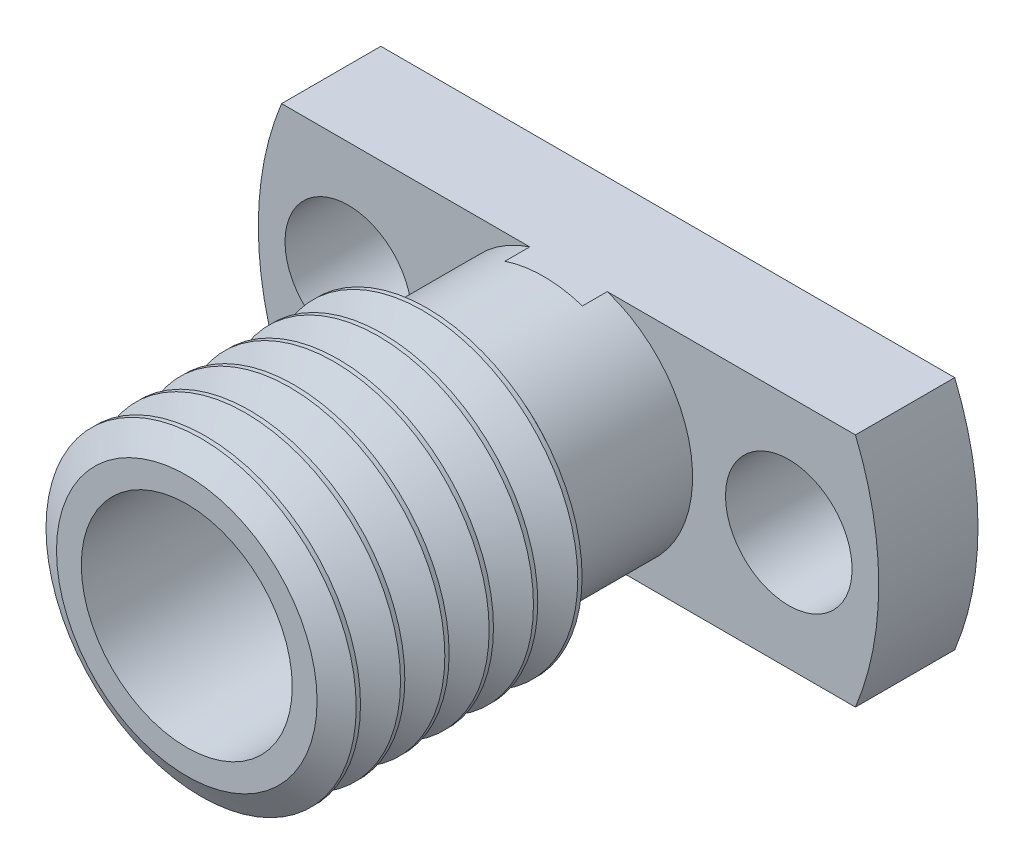
ISO-10303-21;
HEADER;
FILE_DESCRIPTION(('STEP AP214'),'2;1');
FILE_NAME('part.step','',(''),(''),'','','');
FILE_SCHEMA(('AUTOMOTIVE_DESIGN { 1 0 10303 214 1 1 1 1 }'));
ENDSEC;
DATA;
#1=APPLICATION_CONTEXT('core data for automotive mechanical design processes');
#2=APPLICATION_PROTOCOL_DEFINITION('international standard','automotive_design',2000,#1);
#3=PRODUCT_CONTEXT('',#1,'mechanical');
#4=PRODUCT('Part','Part','',(#3));
#5=PRODUCT_RELATED_PRODUCT_CATEGORY('part','',(#4));
#6=PRODUCT_DEFINITION_FORMATION('','',#4);
#7=PRODUCT_DEFINITION_CONTEXT('part definition',#1,'design');
#8=PRODUCT_DEFINITION('design','',#6,#7);
#9=PRODUCT_DEFINITION_SHAPE('','',#8);
#10=(LENGTH_UNIT() NAMED_UNIT(*) SI_UNIT(.MILLI.,.METRE.));
#11=(NAMED_UNIT(*) PLANE_ANGLE_UNIT() SI_UNIT($,.RADIAN.));
#12=(NAMED_UNIT(*) SI_UNIT($,.STERADIAN.) SOLID_ANGLE_UNIT());
#13=UNCERTAINTY_MEASURE_WITH_UNIT(LENGTH_MEASURE(1.E-05),#10,'distance_accuracy_value','');
#14=(GEOMETRIC_REPRESENTATION_CONTEXT(3) GLOBAL_UNCERTAINTY_ASSIGNED_CONTEXT((#13)) GLOBAL_UNIT_ASSIGNED_CONTEXT((#10,
#11,#12)) REPRESENTATION_CONTEXT('',''));
#15=CARTESIAN_POINT('',(0.,0.,0.));
#16=DIRECTION('',(0.,0.,1.));
#17=DIRECTION('',(1.,0.,0.));
#18=AXIS2_PLACEMENT_3D('',#15,#16,#17);
#19=CARTESIAN_POINT('',(0.,0.,6.79387936779219));
#20=DIRECTION('',(0.,0.,1.));
#21=DIRECTION('',(1.,0.,0.));
#22=AXIS2_PLACEMENT_3D('',#19,#20,#21);
#23=CYLINDRICAL_SURFACE('',#22,3.175);
#24=CARTESIAN_POINT('',(0.,0.,5.83651259567367));
#25=DIRECTION('',(0.,0.,1.));
#26=DIRECTION('',(1.,0.,0.));
#27=AXIS2_PLACEMENT_3D('',#24,#25,#26);
#28=CIRCLE('',#27,3.175);
#29=CARTESIAN_POINT('',(3.175,0.,5.83651259567367));
#30=VERTEX_POINT('',#29);
#31=EDGE_CURVE('E232',#30,#30,#28,.T.);
#32=ORIENTED_EDGE('',*,*,#31,.T.);
#33=EDGE_LOOP('',(#32));
#34=FACE_BOUND('',#33,.T.);
#35=CARTESIAN_POINT('',(0.,0.,5.92450077669817));
#36=DIRECTION('',(0.,0.,-1.));
#37=DIRECTION('',(-1.,0.,0.));
#38=AXIS2_PLACEMENT_3D('',#35,#36,#37);
#39=CIRCLE('',#38,3.175);
#40=CARTESIAN_POINT('',(-3.175,0.,5.92450077669817));
#41=VERTEX_POINT('',#40);
#42=EDGE_CURVE('E222',#41,#41,#39,.T.);
#43=ORIENTED_EDGE('',*,*,#42,.T.);
#44=EDGE_LOOP('',(#43));
#45=FACE_BOUND('',#44,.T.);
#46=ADVANCED_FACE('F37',(#34,#45),#23,.T.);
#47=CARTESIAN_POINT('',(0.,0.,6.74365545281653));
#48=DIRECTION('',(0.,0.,1.));
#49=DIRECTION('',(1.,0.,0.));
#50=AXIS2_PLACEMENT_3D('',#47,#48,#49);
#51=CIRCLE('',#50,3.175);
#52=CARTESIAN_POINT('',(3.175,0.,6.74365545281653));
#53=VERTEX_POINT('',#52);
#54=EDGE_CURVE('E225',#53,#53,#51,.T.);
#55=ORIENTED_EDGE('',*,*,#54,.T.);
#56=EDGE_LOOP('',(#55));
#57=FACE_BOUND('',#56,.T.);
#58=CARTESIAN_POINT('',(0.,0.,6.83164363384103));
#59=DIRECTION('',(0.,0.,-1.));
#60=DIRECTION('',(-1.,0.,0.));
#61=AXIS2_PLACEMENT_3D('',#58,#59,#60);
#62=CIRCLE('',#61,3.175);
#63=CARTESIAN_POINT('',(-3.175,0.,6.83164363384103));
#64=VERTEX_POINT('',#63);
#65=EDGE_CURVE('E215',#64,#64,#62,.T.);
#66=ORIENTED_EDGE('',*,*,#65,.T.);
#67=EDGE_LOOP('',(#66));
#68=FACE_BOUND('',#67,.T.);
#69=ADVANCED_FACE('F293',(#57,#68),#23,.T.);
#70=CARTESIAN_POINT('',(0.,0.,7.65079830995939));
#71=DIRECTION('',(0.,0.,1.));
#72=DIRECTION('',(1.,0.,0.));
#73=AXIS2_PLACEMENT_3D('',#70,#71,#72);
#74=CIRCLE('',#73,3.175);
#75=CARTESIAN_POINT('',(3.175,0.,7.65079830995939));
#76=VERTEX_POINT('',#75);
#77=EDGE_CURVE('E218',#76,#76,#74,.T.);
#78=ORIENTED_EDGE('',*,*,#77,.T.);
#79=EDGE_LOOP('',(#78));
#80=FACE_BOUND('',#79,.T.);
#81=CARTESIAN_POINT('',(0.,0.,7.73878649098389));
#82=DIRECTION('',(0.,0.,-1.));
#83=DIRECTION('',(-1.,0.,0.));
#84=AXIS2_PLACEMENT_3D('',#81,#82,#83);
#85=CIRCLE('',#84,3.175);
#86=CARTESIAN_POINT('',(-3.175,0.,7.73878649098389));
#87=VERTEX_POINT('',#86);
#88=EDGE_CURVE('E208',#87,#87,#85,.T.);
#89=ORIENTED_EDGE('',*,*,#88,.T.);
#90=EDGE_LOOP('',(#89));
#91=FACE_BOUND('',#90,.T.);
#92=ADVANCED_FACE('F298',(#80,#91),#23,.T.);
#93=CARTESIAN_POINT('',(0.,0.,8.55794116710225));
#94=DIRECTION('',(0.,0.,1.));
#95=DIRECTION('',(1.,0.,0.));
#96=AXIS2_PLACEMENT_3D('',#93,#94,#95);
#97=CIRCLE('',#96,3.175);
#98=CARTESIAN_POINT('',(3.175,0.,8.55794116710225));
#99=VERTEX_POINT('',#98);
#100=EDGE_CURVE('E211',#99,#99,#97,.T.);
#101=ORIENTED_EDGE('',*,*,#100,.T.);
#102=EDGE_LOOP('',(#101));
#103=FACE_BOUND('',#102,.T.);
#104=CARTESIAN_POINT('',(0.,0.,8.64592934812674));
#105=DIRECTION('',(0.,0.,-1.));
#106=DIRECTION('',(-1.,0.,0.));
#107=AXIS2_PLACEMENT_3D('',#104,#105,#106);
#108=CIRCLE('',#107,3.175);
#109=CARTESIAN_POINT('',(-3.175,0.,8.64592934812674));
#110=VERTEX_POINT('',#109);
#111=EDGE_CURVE('E202',#110,#110,#108,.T.);
#112=ORIENTED_EDGE('',*,*,#111,.T.);
#113=EDGE_LOOP('',(#112));
#114=FACE_BOUND('',#113,.T.);
#115=ADVANCED_FACE('F402',(#103,#114),#23,.T.);
#116=CARTESIAN_POINT('',(0.,0.,9.4650840242451));
#117=DIRECTION('',(0.,0.,1.));
#118=DIRECTION('',(1.,0.,0.));
#119=AXIS2_PLACEMENT_3D('',#116,#117,#118);
#120=CIRCLE('',#119,3.175);
#121=CARTESIAN_POINT('',(3.175,0.,9.4650840242451));
#122=VERTEX_POINT('',#121);
#123=EDGE_CURVE('E125',#122,#122,#120,.T.);
#124=ORIENTED_EDGE('',*,*,#123,.T.);
#125=EDGE_LOOP('',(#124));
#126=FACE_BOUND('',#125,.T.);
#127=CARTESIAN_POINT('',(0.,0.,9.5530722052696));
#128=DIRECTION('',(0.,0.,1.));
#129=DIRECTION('',(1.,0.,0.));
#130=AXIS2_PLACEMENT_3D('',#127,#128,#129);
#131=CIRCLE('',#130,3.175);
#132=CARTESIAN_POINT('',(3.175,0.,9.5530722052696));
#133=VERTEX_POINT('',#132);
#134=EDGE_CURVE('E179',#133,#133,#131,.T.);
#135=ORIENTED_EDGE('',*,*,#134,.F.);
#136=EDGE_LOOP('',(#135));
#137=FACE_BOUND('',#136,.T.);
#138=ADVANCED_FACE('F286',(#126,#137),#23,.T.);
#139=CARTESIAN_POINT('',(0.,2.54,2.032));
#140=DIRECTION('',(0.,0.,-1.));
#141=DIRECTION('',(-1.,0.,0.));
#142=AXIS2_PLACEMENT_3D('',#139,#140,#141);
#143=PLANE('',#142);
#144=CARTESIAN_POINT('',(4.5085,0.,2.032));
#145=DIRECTION('',(0.,0.,-1.));
#146=DIRECTION('',(-1.,0.,0.));
#147=AXIS2_PLACEMENT_3D('',#144,#145,#146);
#148=CIRCLE('',#147,1.2954);
#149=CARTESIAN_POINT('',(3.2131,0.,2.032));
#150=VERTEX_POINT('',#149);
#151=EDGE_CURVE('E149',#150,#150,#148,.F.);
#152=ORIENTED_EDGE('',*,*,#151,.F.);
#153=EDGE_LOOP('',(#152));
#154=FACE_BOUND('',#153,.T.);
#155=CARTESIAN_POINT('',(0.,0.,2.032));
#156=DIRECTION('',(0.,0.,1.));
#157=DIRECTION('',(1.,0.,0.));
#158=AXIS2_PLACEMENT_3D('',#155,#156,#157);
#159=CIRCLE('',#158,2.54);
#160=CARTESIAN_POINT('',(0.793114745796598,-2.413,2.032));
#161=VERTEX_POINT('',#160);
#162=CARTESIAN_POINT('',(0.793114745796598,2.413,2.032));
#163=VERTEX_POINT('',#162);
#164=EDGE_CURVE('E154',#161,#163,#159,.T.);
#165=ORIENTED_EDGE('',*,*,#164,.F.);
#166=DIRECTION('',(1.,0.,0.));
#167=VECTOR('',#166,1.);
#168=CARTESIAN_POINT('',(0.,-2.413,2.032));
#169=LINE('',#168,#167);
#170=CARTESIAN_POINT('',(5.87366418856237,-2.413,2.032));
#171=VERTEX_POINT('',#170);
#172=EDGE_CURVE('E143',#161,#171,#169,.T.);
#173=ORIENTED_EDGE('',*,*,#172,.T.);
#174=CARTESIAN_POINT('',(0.,0.,2.032));
#175=DIRECTION('',(0.,0.,-1.));
#176=DIRECTION('',(-1.,0.,0.));
#177=AXIS2_PLACEMENT_3D('',#174,#175,#176);
#178=CIRCLE('',#177,6.35);
#179=CARTESIAN_POINT('',(5.87366418856237,2.413,2.032));
#180=VERTEX_POINT('',#179);
#181=EDGE_CURVE('E12',#171,#180,#178,.F.);
#182=ORIENTED_EDGE('',*,*,#181,.T.);
#183=DIRECTION('',(-1.,0.,0.));
#184=VECTOR('',#183,1.);
#185=CARTESIAN_POINT('',(0.,2.413,2.032));
#186=LINE('',#185,#184);
#187=EDGE_CURVE('E142',#180,#163,#186,.T.);
#188=ORIENTED_EDGE('',*,*,#187,.T.);
#189=EDGE_LOOP('',(#165,#173,#182,#188));
#190=FACE_BOUND('',#189,.T.);
#191=ADVANCED_FACE('F269',(#154,#190),#143,.F.);
#192=CARTESIAN_POINT('',(0.,8.255,0.));
#193=DIRECTION('',(0.,0.,1.));
#194=DIRECTION('',(1.,0.,0.));
#195=AXIS2_PLACEMENT_3D('',#192,#193,#194);
#196=PLANE('',#195);
#197=DIRECTION('',(1.,0.,0.));
#198=VECTOR('',#197,1.);
#199=CARTESIAN_POINT('',(5.87366418856237,-2.413,0.));
#200=LINE('',#199,#198);
#201=CARTESIAN_POINT('',(-5.87366418856237,-2.413,0.));
#202=VERTEX_POINT('',#201);
#203=CARTESIAN_POINT('',(5.87366418856237,-2.413,0.));
#204=VERTEX_POINT('',#203);
#205=EDGE_CURVE('E111',#202,#204,#200,.T.);
#206=ORIENTED_EDGE('',*,*,#205,.F.);
#207=CARTESIAN_POINT('',(0.,0.,0.));
#208=DIRECTION('',(0.,0.,1.));
#209=DIRECTION('',(-1.,0.,0.));
#210=AXIS2_PLACEMENT_3D('',#207,#208,#209);
#211=CIRCLE('',#210,6.35);
#212=CARTESIAN_POINT('',(-5.87366418856237,2.413,0.));
#213=VERTEX_POINT('',#212);
#214=EDGE_CURVE('E119',#213,#202,#211,.T.);
#215=ORIENTED_EDGE('',*,*,#214,.F.);
#216=DIRECTION('',(-1.,0.,0.));
#217=VECTOR('',#216,1.);
#218=CARTESIAN_POINT('',(5.87366418856237,2.413,0.));
#219=LINE('',#218,#217);
#220=CARTESIAN_POINT('',(5.87366418856237,2.413,0.));
#221=VERTEX_POINT('',#220);
#222=EDGE_CURVE('E130',#221,#213,#219,.T.);
#223=ORIENTED_EDGE('',*,*,#222,.F.);
#224=CARTESIAN_POINT('',(0.,0.,0.));
#225=DIRECTION('',(0.,0.,1.));
#226=DIRECTION('',(1.,0.,0.));
#227=AXIS2_PLACEMENT_3D('',#224,#225,#226);
#228=CIRCLE('',#227,6.35);
#229=EDGE_CURVE('E54',#204,#221,#228,.T.);
#230=ORIENTED_EDGE('',*,*,#229,.F.);
#231=EDGE_LOOP('',(#206,#215,#223,#230));
#232=FACE_BOUND('',#231,.T.);
#233=CARTESIAN_POINT('',(-4.5085,0.,0.));
#234=DIRECTION('',(0.,0.,1.));
#235=DIRECTION('',(1.,0.,0.));
#236=AXIS2_PLACEMENT_3D('',#233,#234,#235);
#237=CIRCLE('',#236,1.2954);
#238=CARTESIAN_POINT('',(-3.2131,0.,0.));
#239=VERTEX_POINT('',#238);
#240=EDGE_CURVE('E150',#239,#239,#237,.T.);
#241=ORIENTED_EDGE('',*,*,#240,.T.);
#242=EDGE_LOOP('',(#241));
#243=FACE_BOUND('',#242,.T.);
#244=CARTESIAN_POINT('',(0.,0.,0.));
#245=DIRECTION('',(0.,0.,1.));
#246=DIRECTION('',(1.,0.,0.));
#247=AXIS2_PLACEMENT_3D('',#244,#245,#246);
#248=CIRCLE('',#247,0.762);
#249=CARTESIAN_POINT('',(0.762,0.,0.));
#250=VERTEX_POINT('',#249);
#251=EDGE_CURVE('E158',#250,#250,#248,.T.);
#252=ORIENTED_EDGE('',*,*,#251,.T.);
#253=EDGE_LOOP('',(#252));
#254=FACE_BOUND('',#253,.T.);
#255=CARTESIAN_POINT('',(4.5085,0.,0.));
#256=DIRECTION('',(0.,0.,1.));
#257=DIRECTION('',(-1.,0.,0.));
#258=AXIS2_PLACEMENT_3D('',#255,#256,#257);
#259=CIRCLE('',#258,1.2954);
#260=CARTESIAN_POINT('',(3.2131,0.,0.));
#261=VERTEX_POINT('',#260);
#262=EDGE_CURVE('E146',#261,#261,#259,.T.);
#263=ORIENTED_EDGE('',*,*,#262,.T.);
#264=EDGE_LOOP('',(#263));
#265=FACE_BOUND('',#264,.T.);
#266=ADVANCED_FACE('F127',(#232,#243,#254,#265),#196,.F.);
#267=CARTESIAN_POINT('',(-4.5085,0.,2.032));
#268=DIRECTION('',(0.,0.,-1.));
#269=DIRECTION('',(-1.,0.,0.));
#270=AXIS2_PLACEMENT_3D('',#267,#268,#269);
#271=CIRCLE('',#270,1.2954);
#272=CARTESIAN_POINT('',(-5.8039,0.,2.032));
#273=VERTEX_POINT('',#272);
#274=EDGE_CURVE('E153',#273,#273,#271,.F.);
#275=ORIENTED_EDGE('',*,*,#274,.F.);
#276=EDGE_LOOP('',(#275));
#277=FACE_BOUND('',#276,.T.);
#278=CARTESIAN_POINT('',(0.,0.,2.032));
#279=DIRECTION('',(0.,0.,-1.));
#280=DIRECTION('',(-1.,0.,0.));
#281=AXIS2_PLACEMENT_3D('',#278,#279,#280);
#282=CIRCLE('',#281,6.35);
#283=CARTESIAN_POINT('',(-5.87366418856237,2.413,2.032));
#284=VERTEX_POINT('',#283);
#285=CARTESIAN_POINT('',(-5.87366418856237,-2.413,2.032));
#286=VERTEX_POINT('',#285);
#287=EDGE_CURVE('E46',#284,#286,#282,.F.);
#288=ORIENTED_EDGE('',*,*,#287,.T.);
#289=CARTESIAN_POINT('',(-0.793114745796598,-2.413,2.032));
#290=VERTEX_POINT('',#289);
#291=EDGE_CURVE('E113',#286,#290,#169,.T.);
#292=ORIENTED_EDGE('',*,*,#291,.T.);
#293=CARTESIAN_POINT('',(-0.793114745796598,2.413,2.032));
#294=VERTEX_POINT('',#293);
#295=EDGE_CURVE('E157',#294,#290,#159,.T.);
#296=ORIENTED_EDGE('',*,*,#295,.F.);
#297=EDGE_CURVE('E62',#294,#284,#186,.T.);
#298=ORIENTED_EDGE('',*,*,#297,.T.);
#299=EDGE_LOOP('',(#288,#292,#296,#298));
#300=FACE_BOUND('',#299,.T.);
#301=ADVANCED_FACE('F276',(#277,#300),#143,.F.);
#302=CARTESIAN_POINT('',(0.,0.,4.92936973853082));
#303=DIRECTION('',(0.,0.,1.));
#304=DIRECTION('',(1.,0.,0.));
#305=AXIS2_PLACEMENT_3D('',#302,#303,#304);
#306=CIRCLE('',#305,3.175);
#307=CARTESIAN_POINT('',(3.175,0.,4.92936973853082));
#308=VERTEX_POINT('',#307);
#309=EDGE_CURVE('E41',#308,#308,#306,.T.);
#310=ORIENTED_EDGE('',*,*,#309,.T.);
#311=EDGE_LOOP('',(#310));
#312=FACE_BOUND('',#311,.T.);
#313=CARTESIAN_POINT('',(0.,0.,5.01735791955532));
#314=DIRECTION('',(0.,0.,-1.));
#315=DIRECTION('',(-1.,0.,0.));
#316=AXIS2_PLACEMENT_3D('',#313,#314,#315);
#317=CIRCLE('',#316,3.175);
#318=CARTESIAN_POINT('',(-3.175,0.,5.01735791955532));
#319=VERTEX_POINT('',#318);
#320=EDGE_CURVE('E229',#319,#319,#317,.T.);
#321=ORIENTED_EDGE('',*,*,#320,.T.);
#322=EDGE_LOOP('',(#321));
#323=FACE_BOUND('',#322,.T.);
#324=ADVANCED_FACE('F39',(#312,#323),#23,.T.);
#325=CARTESIAN_POINT('',(0.,0.,9.5530722052696));
#326=DIRECTION('',(0.,0.,-1.));
#327=DIRECTION('',(-1.,0.,0.));
#328=AXIS2_PLACEMENT_3D('',#325,#326,#327);
#329=CONICAL_SURFACE('',#328,3.175,1.0471975511966);
#330=CARTESIAN_POINT('',(0.,0.,9.84636614201792));
#331=DIRECTION('',(0.,0.,1.));
#332=DIRECTION('',(1.,0.,0.));
#333=AXIS2_PLACEMENT_3D('',#330,#331,#332);
#334=CIRCLE('',#333,2.667);
#335=CARTESIAN_POINT('',(2.667,0.,9.84636614201792));
#336=VERTEX_POINT('',#335);
#337=EDGE_CURVE('E176',#336,#336,#334,.T.);
#338=ORIENTED_EDGE('',*,*,#337,.F.);
#339=EDGE_LOOP('',(#338));
#340=FACE_BOUND('',#339,.T.);
#341=ORIENTED_EDGE('',*,*,#134,.T.);
#342=EDGE_LOOP('',(#341));
#343=FACE_BOUND('',#342,.T.);
#344=ADVANCED_FACE('F284',(#340,#343),#329,.T.);
#345=CARTESIAN_POINT('',(0.,2.667,9.84636614201792));
#346=DIRECTION('',(0.,0.,-1.));
#347=DIRECTION('',(-1.,0.,0.));
#348=AXIS2_PLACEMENT_3D('',#345,#346,#347);
#349=PLANE('',#348);
#350=CARTESIAN_POINT('',(0.,0.,9.84636614201792));
#351=DIRECTION('',(0.,0.,1.));
#352=DIRECTION('',(1.,0.,0.));
#353=AXIS2_PLACEMENT_3D('',#350,#351,#352);
#354=CIRCLE('',#353,2.159);
#355=CARTESIAN_POINT('',(2.159,0.,9.84636614201792));
#356=VERTEX_POINT('',#355);
#357=EDGE_CURVE('E173',#356,#356,#354,.T.);
#358=ORIENTED_EDGE('',*,*,#357,.F.);
#359=EDGE_LOOP('',(#358));
#360=FACE_BOUND('',#359,.T.);
#361=ORIENTED_EDGE('',*,*,#337,.T.);
#362=EDGE_LOOP('',(#361));
#363=FACE_BOUND('',#362,.T.);
#364=ADVANCED_FACE('F389',(#360,#363),#349,.F.);
#365=CARTESIAN_POINT('',(0.,0.,6.79387936779219));
#366=DIRECTION('',(0.,0.,1.));
#367=DIRECTION('',(1.,0.,0.));
#368=AXIS2_PLACEMENT_3D('',#365,#366,#367);
#369=CYLINDRICAL_SURFACE('',#368,2.159);
#370=CARTESIAN_POINT('',(0.,0.,6.79387936779219));
#371=DIRECTION('',(0.,0.,1.));
#372=DIRECTION('',(1.,0.,0.));
#373=AXIS2_PLACEMENT_3D('',#370,#371,#372);
#374=CIRCLE('',#373,2.159);
#375=CARTESIAN_POINT('',(2.159,0.,6.79387936779219));
#376=VERTEX_POINT('',#375);
#377=EDGE_CURVE('E170',#376,#376,#374,.T.);
#378=ORIENTED_EDGE('',*,*,#377,.F.);
#379=EDGE_LOOP('',(#378));
#380=FACE_BOUND('',#379,.T.);
#381=ORIENTED_EDGE('',*,*,#357,.T.);
#382=EDGE_LOOP('',(#381));
#383=FACE_BOUND('',#382,.T.);
#384=ADVANCED_FACE('F385',(#380,#383),#369,.F.);
#385=CARTESIAN_POINT('',(0.,2.159,6.79387936779219));
#386=DIRECTION('',(0.,0.,-1.));
#387=DIRECTION('',(-1.,0.,0.));
#388=AXIS2_PLACEMENT_3D('',#385,#386,#387);
#389=PLANE('',#388);
#390=CARTESIAN_POINT('',(0.,0.,6.79387936779219));
#391=DIRECTION('',(0.,0.,1.));
#392=DIRECTION('',(1.,0.,0.));
#393=AXIS2_PLACEMENT_3D('',#390,#391,#392);
#394=CIRCLE('',#393,1.524);
#395=CARTESIAN_POINT('',(1.524,0.,6.79387936779219));
#396=VERTEX_POINT('',#395);
#397=EDGE_CURVE('E167',#396,#396,#394,.T.);
#398=ORIENTED_EDGE('',*,*,#397,.F.);
#399=EDGE_LOOP('',(#398));
#400=FACE_BOUND('',#399,.T.);
#401=ORIENTED_EDGE('',*,*,#377,.T.);
#402=EDGE_LOOP('',(#401));
#403=FACE_BOUND('',#402,.T.);
#404=ADVANCED_FACE('F381',(#400,#403),#389,.F.);
#405=CARTESIAN_POINT('',(0.,0.,6.79387936779219));
#406=DIRECTION('',(0.,0.,1.));
#407=DIRECTION('',(1.,0.,0.));
#408=AXIS2_PLACEMENT_3D('',#405,#406,#407);
#409=CYLINDRICAL_SURFACE('',#408,1.524);
#410=CARTESIAN_POINT('',(0.,0.,3.10037037097902));
#411=DIRECTION('',(0.,0.,1.));
#412=DIRECTION('',(1.,0.,0.));
#413=AXIS2_PLACEMENT_3D('',#410,#411,#412);
#414=CIRCLE('',#413,1.524);
#415=CARTESIAN_POINT('',(1.524,0.,3.10037037097902));
#416=VERTEX_POINT('',#415);
#417=EDGE_CURVE('E164',#416,#416,#414,.T.);
#418=ORIENTED_EDGE('',*,*,#417,.F.);
#419=EDGE_LOOP('',(#418));
#420=FACE_BOUND('',#419,.T.);
#421=ORIENTED_EDGE('',*,*,#397,.T.);
#422=EDGE_LOOP('',(#421));
#423=FACE_BOUND('',#422,.T.);
#424=ADVANCED_FACE('F373',(#420,#423),#409,.F.);
#425=CARTESIAN_POINT('',(0.,1.524,3.10037037097902));
#426=DIRECTION('',(0.,0.,-1.));
#427=DIRECTION('',(-1.,0.,0.));
#428=AXIS2_PLACEMENT_3D('',#425,#426,#427);
#429=PLANE('',#428);
#430=CARTESIAN_POINT('',(0.,0.,3.10037037097902));
#431=DIRECTION('',(0.,0.,1.));
#432=DIRECTION('',(1.,0.,0.));
#433=AXIS2_PLACEMENT_3D('',#430,#431,#432);
#434=CIRCLE('',#433,0.762);
#435=CARTESIAN_POINT('',(0.762,0.,3.10037037097902));
#436=VERTEX_POINT('',#435);
#437=EDGE_CURVE('E161',#436,#436,#434,.T.);
#438=ORIENTED_EDGE('',*,*,#437,.F.);
#439=EDGE_LOOP('',(#438));
#440=FACE_BOUND('',#439,.T.);
#441=ORIENTED_EDGE('',*,*,#417,.T.);
#442=EDGE_LOOP('',(#441));
#443=FACE_BOUND('',#442,.T.);
#444=ADVANCED_FACE('F367',(#440,#443),#429,.F.);
#445=CARTESIAN_POINT('',(0.,0.,6.79387936779219));
#446=DIRECTION('',(0.,0.,1.));
#447=DIRECTION('',(1.,0.,0.));
#448=AXIS2_PLACEMENT_3D('',#445,#446,#447);
#449=CYLINDRICAL_SURFACE('',#448,0.762);
#450=ORIENTED_EDGE('',*,*,#251,.F.);
#451=EDGE_LOOP('',(#450));
#452=FACE_BOUND('',#451,.T.);
#453=ORIENTED_EDGE('',*,*,#437,.T.);
#454=EDGE_LOOP('',(#453));
#455=FACE_BOUND('',#454,.T.);
#456=ADVANCED_FACE('F363',(#452,#455),#449,.F.);
#457=CARTESIAN_POINT('',(0.,0.,6.79387936779219));
#458=DIRECTION('',(0.,0.,1.));
#459=DIRECTION('',(1.,0.,0.));
#460=AXIS2_PLACEMENT_3D('',#457,#458,#459);
#461=CYLINDRICAL_SURFACE('',#460,2.54);
#462=CARTESIAN_POINT('',(0.,0.,4.47683248334787));
#463=DIRECTION('',(0.,0.,-1.));
#464=DIRECTION('',(-1.,0.,0.));
#465=AXIS2_PLACEMENT_3D('',#462,#463,#464);
#466=CIRCLE('',#465,2.54);
#467=CARTESIAN_POINT('',(-2.54,0.,4.47683248334787));
#468=VERTEX_POINT('',#467);
#469=EDGE_CURVE('E235',#468,#468,#466,.T.);
#470=ORIENTED_EDGE('',*,*,#469,.T.);
#471=EDGE_LOOP('',(#470));
#472=FACE_BOUND('',#471,.T.);
#473=ORIENTED_EDGE('',*,*,#295,.T.);
#474=DIRECTION('',(0.,0.,1.));
#475=VECTOR('',#474,1.);
#476=CARTESIAN_POINT('',(-0.793114745796598,-2.413,6.79387936779219));
#477=LINE('',#476,#475);
#478=CARTESIAN_POINT('',(-0.793114745796596,-2.413,2.54));
#479=VERTEX_POINT('',#478);
#480=EDGE_CURVE('E198',#290,#479,#477,.T.);
#481=ORIENTED_EDGE('',*,*,#480,.T.);
#482=CARTESIAN_POINT('',(0.,0.,2.54));
#483=DIRECTION('',(0.,0.,1.));
#484=DIRECTION('',(1.,0.,0.));
#485=AXIS2_PLACEMENT_3D('',#482,#483,#484);
#486=CIRCLE('',#485,2.54);
#487=CARTESIAN_POINT('',(0.793114745796599,-2.413,2.54));
#488=VERTEX_POINT('',#487);
#489=EDGE_CURVE('E192',#479,#488,#486,.T.);
#490=ORIENTED_EDGE('',*,*,#489,.T.);
#491=DIRECTION('',(0.,0.,1.));
#492=VECTOR('',#491,1.);
#493=CARTESIAN_POINT('',(0.793114745796598,-2.413,6.79387936779219));
#494=LINE('',#493,#492);
#495=EDGE_CURVE('E195',#488,#161,#494,.F.);
#496=ORIENTED_EDGE('',*,*,#495,.T.);
#497=ORIENTED_EDGE('',*,*,#164,.T.);
#498=DIRECTION('',(0.,0.,1.));
#499=VECTOR('',#498,1.);
#500=CARTESIAN_POINT('',(0.793114745796598,2.413,6.79387936779219));
#501=LINE('',#500,#499);
#502=CARTESIAN_POINT('',(0.793114745796597,2.413,2.54));
#503=VERTEX_POINT('',#502);
#504=EDGE_CURVE('E191',#163,#503,#501,.T.);
#505=ORIENTED_EDGE('',*,*,#504,.T.);
#506=CARTESIAN_POINT('',(-0.793114745796597,2.413,2.54));
#507=VERTEX_POINT('',#506);
#508=EDGE_CURVE('E188',#503,#507,#486,.T.);
#509=ORIENTED_EDGE('',*,*,#508,.T.);
#510=DIRECTION('',(0.,0.,1.));
#511=VECTOR('',#510,1.);
#512=CARTESIAN_POINT('',(-0.793114745796598,2.413,6.79387936779219));
#513=LINE('',#512,#511);
#514=EDGE_CURVE('E182',#507,#294,#513,.F.);
#515=ORIENTED_EDGE('',*,*,#514,.T.);
#516=EDGE_LOOP('',(#473,#481,#490,#496,#497,#505,#509,#515));
#517=FACE_BOUND('',#516,.T.);
#518=ADVANCED_FACE('F263',(#472,#517),#461,.T.);
#519=CARTESIAN_POINT('',(-4.5085,0.,2.54));
#520=DIRECTION('',(0.,0.,-1.));
#521=DIRECTION('',(-1.,0.,0.));
#522=AXIS2_PLACEMENT_3D('',#519,#520,#521);
#523=CYLINDRICAL_SURFACE('',#522,1.2954);
#524=ORIENTED_EDGE('',*,*,#240,.F.);
#525=EDGE_LOOP('',(#524));
#526=FACE_BOUND('',#525,.T.);
#527=ORIENTED_EDGE('',*,*,#274,.T.);
#528=EDGE_LOOP('',(#527));
#529=FACE_BOUND('',#528,.T.);
#530=ADVANCED_FACE('F358',(#526,#529),#523,.F.);
#531=CARTESIAN_POINT('',(4.5085,0.,2.54));
#532=DIRECTION('',(0.,0.,-1.));
#533=DIRECTION('',(-1.,0.,0.));
#534=AXIS2_PLACEMENT_3D('',#531,#532,#533);
#535=CYLINDRICAL_SURFACE('',#534,1.2954);
#536=ORIENTED_EDGE('',*,*,#262,.F.);
#537=EDGE_LOOP('',(#536));
#538=FACE_BOUND('',#537,.T.);
#539=ORIENTED_EDGE('',*,*,#151,.T.);
#540=EDGE_LOOP('',(#539));
#541=FACE_BOUND('',#540,.T.);
#542=ADVANCED_FACE('F353',(#538,#541),#535,.F.);
#543=CARTESIAN_POINT('',(0.,0.,2.54));
#544=DIRECTION('',(0.,0.,-1.));
#545=DIRECTION('',(-1.,0.,0.));
#546=AXIS2_PLACEMENT_3D('',#543,#544,#545);
#547=CYLINDRICAL_SURFACE('',#546,6.35);
#548=DIRECTION('',(0.,0.,-1.));
#549=VECTOR('',#548,1.);
#550=CARTESIAN_POINT('',(-5.87366418856237,2.413,2.54));
#551=LINE('',#550,#549);
#552=EDGE_CURVE('E121',#284,#213,#551,.T.);
#553=ORIENTED_EDGE('',*,*,#552,.T.);
#554=ORIENTED_EDGE('',*,*,#214,.T.);
#555=DIRECTION('',(0.,0.,-1.));
#556=VECTOR('',#555,1.);
#557=CARTESIAN_POINT('',(-5.87366418856237,-2.413,2.54));
#558=LINE('',#557,#556);
#559=EDGE_CURVE('E106',#286,#202,#558,.T.);
#560=ORIENTED_EDGE('',*,*,#559,.F.);
#561=ORIENTED_EDGE('',*,*,#287,.F.);
#562=EDGE_LOOP('',(#553,#554,#560,#561));
#563=FACE_BOUND('',#562,.T.);
#564=ADVANCED_FACE('F120',(#563),#547,.T.);
#565=CARTESIAN_POINT('',(0.,0.,2.54));
#566=DIRECTION('',(0.,0.,-1.));
#567=DIRECTION('',(-1.,0.,0.));
#568=AXIS2_PLACEMENT_3D('',#565,#566,#567);
#569=CYLINDRICAL_SURFACE('',#568,6.35);
#570=DIRECTION('',(0.,0.,-1.));
#571=VECTOR('',#570,1.);
#572=CARTESIAN_POINT('',(5.87366418856237,-2.413,2.54));
#573=LINE('',#572,#571);
#574=EDGE_CURVE('E116',#171,#204,#573,.T.);
#575=ORIENTED_EDGE('',*,*,#574,.T.);
#576=ORIENTED_EDGE('',*,*,#229,.T.);
#577=DIRECTION('',(0.,0.,-1.));
#578=VECTOR('',#577,1.);
#579=CARTESIAN_POINT('',(5.87366418856237,2.413,2.54));
#580=LINE('',#579,#578);
#581=EDGE_CURVE('E137',#180,#221,#580,.T.);
#582=ORIENTED_EDGE('',*,*,#581,.F.);
#583=ORIENTED_EDGE('',*,*,#181,.F.);
#584=EDGE_LOOP('',(#575,#576,#582,#583));
#585=FACE_BOUND('',#584,.T.);
#586=ADVANCED_FACE('F270',(#585),#569,.T.);
#587=CARTESIAN_POINT('',(0.,0.,2.54));
#588=DIRECTION('',(0.,0.,1.));
#589=DIRECTION('',(1.,0.,0.));
#590=AXIS2_PLACEMENT_3D('',#587,#588,#589);
#591=PLANE('',#590);
#592=DIRECTION('',(-1.,0.,0.));
#593=VECTOR('',#592,1.);
#594=CARTESIAN_POINT('',(5.87366418856237,2.413,2.54));
#595=LINE('',#594,#593);
#596=EDGE_CURVE('E138',#503,#507,#595,.T.);
#597=ORIENTED_EDGE('',*,*,#596,.T.);
#598=ORIENTED_EDGE('',*,*,#508,.F.);
#599=EDGE_LOOP('',(#597,#598));
#600=FACE_BOUND('',#599,.T.);
#601=ADVANCED_FACE('F260',(#600),#591,.F.);
#602=DIRECTION('',(1.,0.,0.));
#603=VECTOR('',#602,1.);
#604=CARTESIAN_POINT('',(5.87366418856237,-2.413,2.54));
#605=LINE('',#604,#603);
#606=EDGE_CURVE('E135',#479,#488,#605,.T.);
#607=ORIENTED_EDGE('',*,*,#606,.T.);
#608=ORIENTED_EDGE('',*,*,#489,.F.);
#609=EDGE_LOOP('',(#607,#608));
#610=FACE_BOUND('',#609,.T.);
#611=ADVANCED_FACE('F274',(#610),#591,.F.);
#612=CARTESIAN_POINT('',(5.87366418856237,-2.413,2.54));
#613=DIRECTION('',(0.,1.,0.));
#614=DIRECTION('',(0.,0.,1.));
#615=AXIS2_PLACEMENT_3D('',#612,#613,#614);
#616=PLANE('',#615);
#617=ORIENTED_EDGE('',*,*,#559,.T.);
#618=ORIENTED_EDGE('',*,*,#205,.T.);
#619=ORIENTED_EDGE('',*,*,#574,.F.);
#620=ORIENTED_EDGE('',*,*,#172,.F.);
#621=ORIENTED_EDGE('',*,*,#495,.F.);
#622=ORIENTED_EDGE('',*,*,#606,.F.);
#623=ORIENTED_EDGE('',*,*,#480,.F.);
#624=ORIENTED_EDGE('',*,*,#291,.F.);
#625=EDGE_LOOP('',(#617,#618,#619,#620,#621,#622,#623,#624));
#626=FACE_BOUND('',#625,.T.);
#627=ADVANCED_FACE('F108',(#626),#616,.F.);
#628=CARTESIAN_POINT('',(5.87366418856237,2.413,2.54));
#629=DIRECTION('',(0.,-1.,0.));
#630=DIRECTION('',(0.,0.,-1.));
#631=AXIS2_PLACEMENT_3D('',#628,#629,#630);
#632=PLANE('',#631);
#633=ORIENTED_EDGE('',*,*,#581,.T.);
#634=ORIENTED_EDGE('',*,*,#222,.T.);
#635=ORIENTED_EDGE('',*,*,#552,.F.);
#636=ORIENTED_EDGE('',*,*,#297,.F.);
#637=ORIENTED_EDGE('',*,*,#514,.F.);
#638=ORIENTED_EDGE('',*,*,#596,.F.);
#639=ORIENTED_EDGE('',*,*,#504,.F.);
#640=ORIENTED_EDGE('',*,*,#187,.F.);
#641=EDGE_LOOP('',(#633,#634,#635,#636,#637,#638,#639,#640));
#642=FACE_BOUND('',#641,.T.);
#643=ADVANCED_FACE('F267',(#642),#632,.F.);
#644=CARTESIAN_POINT('',(0.,0.,9.52374281159477));
#645=DIRECTION('',(0.,0.,1.));
#646=DIRECTION('',(1.,0.,0.));
#647=AXIS2_PLACEMENT_3D('',#644,#645,#646);
#648=CONICAL_SURFACE('',#647,3.2766,1.0471975511966);
#649=CARTESIAN_POINT('',(0.,0.,9.05550668618592));
#650=DIRECTION('',(0.,0.,-1.));
#651=DIRECTION('',(-1.,0.,0.));
#652=AXIS2_PLACEMENT_3D('',#649,#650,#651);
#653=CIRCLE('',#652,2.46559124085269);
#654=CARTESIAN_POINT('',(-2.46559124085269,0.,9.05550668618592));
#655=VERTEX_POINT('',#654);
#656=EDGE_CURVE('E205',#655,#655,#653,.T.);
#657=ORIENTED_EDGE('',*,*,#656,.F.);
#658=EDGE_LOOP('',(#657));
#659=FACE_BOUND('',#658,.T.);
#660=ORIENTED_EDGE('',*,*,#123,.F.);
#661=EDGE_LOOP('',(#660));
#662=FACE_BOUND('',#661,.T.);
#663=ADVANCED_FACE('F340',(#659,#662),#648,.T.);
#664=CARTESIAN_POINT('',(0.,0.,9.05550668618592));
#665=DIRECTION('',(0.,0.,-1.));
#666=DIRECTION('',(-1.,0.,0.));
#667=AXIS2_PLACEMENT_3D('',#664,#665,#666);
#668=CONICAL_SURFACE('',#667,2.46559124085269,1.0471975511966);
#669=ORIENTED_EDGE('',*,*,#656,.T.);
#670=EDGE_LOOP('',(#669));
#671=FACE_BOUND('',#670,.T.);
#672=ORIENTED_EDGE('',*,*,#111,.F.);
#673=EDGE_LOOP('',(#672));
#674=FACE_BOUND('',#673,.T.);
#675=ADVANCED_FACE('F336',(#671,#674),#668,.T.);
#676=CARTESIAN_POINT('',(0.,0.,8.61659995445191));
#677=DIRECTION('',(0.,0.,1.));
#678=DIRECTION('',(1.,0.,0.));
#679=AXIS2_PLACEMENT_3D('',#676,#677,#678);
#680=CONICAL_SURFACE('',#679,3.2766,1.0471975511966);
#681=CARTESIAN_POINT('',(0.,0.,8.14836382904307));
#682=DIRECTION('',(0.,0.,-1.));
#683=DIRECTION('',(-1.,0.,0.));
#684=AXIS2_PLACEMENT_3D('',#681,#682,#683);
#685=CIRCLE('',#684,2.46559124085269);
#686=CARTESIAN_POINT('',(-2.46559124085269,0.,8.14836382904307));
#687=VERTEX_POINT('',#686);
#688=EDGE_CURVE('E212',#687,#687,#685,.T.);
#689=ORIENTED_EDGE('',*,*,#688,.F.);
#690=EDGE_LOOP('',(#689));
#691=FACE_BOUND('',#690,.T.);
#692=ORIENTED_EDGE('',*,*,#100,.F.);
#693=EDGE_LOOP('',(#692));
#694=FACE_BOUND('',#693,.T.);
#695=ADVANCED_FACE('F332',(#691,#694),#680,.T.);
#696=CARTESIAN_POINT('',(0.,0.,8.14836382904307));
#697=DIRECTION('',(0.,0.,-1.));
#698=DIRECTION('',(-1.,0.,0.));
#699=AXIS2_PLACEMENT_3D('',#696,#697,#698);
#700=CONICAL_SURFACE('',#699,2.46559124085269,1.0471975511966);
#701=ORIENTED_EDGE('',*,*,#688,.T.);
#702=EDGE_LOOP('',(#701));
#703=FACE_BOUND('',#702,.T.);
#704=ORIENTED_EDGE('',*,*,#88,.F.);
#705=EDGE_LOOP('',(#704));
#706=FACE_BOUND('',#705,.T.);
#707=ADVANCED_FACE('F328',(#703,#706),#700,.T.);
#708=CARTESIAN_POINT('',(0.,0.,7.70945709730905));
#709=DIRECTION('',(0.,0.,1.));
#710=DIRECTION('',(1.,0.,0.));
#711=AXIS2_PLACEMENT_3D('',#708,#709,#710);
#712=CONICAL_SURFACE('',#711,3.2766,1.0471975511966);
#713=CARTESIAN_POINT('',(0.,0.,7.24122097190021));
#714=DIRECTION('',(0.,0.,-1.));
#715=DIRECTION('',(-1.,0.,0.));
#716=AXIS2_PLACEMENT_3D('',#713,#714,#715);
#717=CIRCLE('',#716,2.46559124085269);
#718=CARTESIAN_POINT('',(-2.46559124085269,0.,7.24122097190021));
#719=VERTEX_POINT('',#718);
#720=EDGE_CURVE('E219',#719,#719,#717,.T.);
#721=ORIENTED_EDGE('',*,*,#720,.F.);
#722=EDGE_LOOP('',(#721));
#723=FACE_BOUND('',#722,.T.);
#724=ORIENTED_EDGE('',*,*,#77,.F.);
#725=EDGE_LOOP('',(#724));
#726=FACE_BOUND('',#725,.T.);
#727=ADVANCED_FACE('F324',(#723,#726),#712,.T.);
#728=CARTESIAN_POINT('',(0.,0.,7.24122097190021));
#729=DIRECTION('',(0.,0.,-1.));
#730=DIRECTION('',(-1.,0.,0.));
#731=AXIS2_PLACEMENT_3D('',#728,#729,#730);
#732=CONICAL_SURFACE('',#731,2.46559124085269,1.0471975511966);
#733=ORIENTED_EDGE('',*,*,#720,.T.);
#734=EDGE_LOOP('',(#733));
#735=FACE_BOUND('',#734,.T.);
#736=ORIENTED_EDGE('',*,*,#65,.F.);
#737=EDGE_LOOP('',(#736));
#738=FACE_BOUND('',#737,.T.);
#739=ADVANCED_FACE('F317',(#735,#738),#732,.T.);
#740=CARTESIAN_POINT('',(0.,0.,6.8023142401662));
#741=DIRECTION('',(0.,0.,1.));
#742=DIRECTION('',(1.,0.,0.));
#743=AXIS2_PLACEMENT_3D('',#740,#741,#742);
#744=CONICAL_SURFACE('',#743,3.2766,1.0471975511966);
#745=CARTESIAN_POINT('',(0.,0.,6.33407811475735));
#746=DIRECTION('',(0.,0.,-1.));
#747=DIRECTION('',(-1.,0.,0.));
#748=AXIS2_PLACEMENT_3D('',#745,#746,#747);
#749=CIRCLE('',#748,2.46559124085269);
#750=CARTESIAN_POINT('',(-2.46559124085269,0.,6.33407811475735));
#751=VERTEX_POINT('',#750);
#752=EDGE_CURVE('E226',#751,#751,#749,.T.);
#753=ORIENTED_EDGE('',*,*,#752,.F.);
#754=EDGE_LOOP('',(#753));
#755=FACE_BOUND('',#754,.T.);
#756=ORIENTED_EDGE('',*,*,#54,.F.);
#757=EDGE_LOOP('',(#756));
#758=FACE_BOUND('',#757,.T.);
#759=ADVANCED_FACE('F307',(#755,#758),#744,.T.);
#760=CARTESIAN_POINT('',(0.,0.,6.33407811475735));
#761=DIRECTION('',(0.,0.,-1.));
#762=DIRECTION('',(-1.,0.,0.));
#763=AXIS2_PLACEMENT_3D('',#760,#761,#762);
#764=CONICAL_SURFACE('',#763,2.46559124085269,1.0471975511966);
#765=ORIENTED_EDGE('',*,*,#752,.T.);
#766=EDGE_LOOP('',(#765));
#767=FACE_BOUND('',#766,.T.);
#768=ORIENTED_EDGE('',*,*,#42,.F.);
#769=EDGE_LOOP('',(#768));
#770=FACE_BOUND('',#769,.T.);
#771=ADVANCED_FACE('F304',(#767,#770),#764,.T.);
#772=CARTESIAN_POINT('',(0.,0.,5.89517138302334));
#773=DIRECTION('',(0.,0.,1.));
#774=DIRECTION('',(1.,0.,0.));
#775=AXIS2_PLACEMENT_3D('',#772,#773,#774);
#776=CONICAL_SURFACE('',#775,3.2766,1.0471975511966);
#777=CARTESIAN_POINT('',(0.,0.,5.42693525761449));
#778=DIRECTION('',(0.,0.,-1.));
#779=DIRECTION('',(-1.,0.,0.));
#780=AXIS2_PLACEMENT_3D('',#777,#778,#779);
#781=CIRCLE('',#780,2.46559124085269);
#782=CARTESIAN_POINT('',(-2.46559124085269,0.,5.42693525761449));
#783=VERTEX_POINT('',#782);
#784=EDGE_CURVE('E233',#783,#783,#781,.T.);
#785=ORIENTED_EDGE('',*,*,#784,.F.);
#786=EDGE_LOOP('',(#785));
#787=FACE_BOUND('',#786,.T.);
#788=ORIENTED_EDGE('',*,*,#31,.F.);
#789=EDGE_LOOP('',(#788));
#790=FACE_BOUND('',#789,.T.);
#791=ADVANCED_FACE('F306',(#787,#790),#776,.T.);
#792=CARTESIAN_POINT('',(0.,0.,5.42693525761449));
#793=DIRECTION('',(0.,0.,-1.));
#794=DIRECTION('',(-1.,0.,0.));
#795=AXIS2_PLACEMENT_3D('',#792,#793,#794);
#796=CONICAL_SURFACE('',#795,2.46559124085269,1.0471975511966);
#797=ORIENTED_EDGE('',*,*,#784,.T.);
#798=EDGE_LOOP('',(#797));
#799=FACE_BOUND('',#798,.T.);
#800=ORIENTED_EDGE('',*,*,#320,.F.);
#801=EDGE_LOOP('',(#800));
#802=FACE_BOUND('',#801,.T.);
#803=ADVANCED_FACE('F314',(#799,#802),#796,.T.);
#804=CARTESIAN_POINT('',(0.,0.,4.98802852588048));
#805=DIRECTION('',(0.,0.,1.));
#806=DIRECTION('',(1.,0.,0.));
#807=AXIS2_PLACEMENT_3D('',#804,#805,#806);
#808=CONICAL_SURFACE('',#807,3.2766,1.0471975511966);
#809=CARTESIAN_POINT('',(0.,0.,4.51979240047164));
#810=DIRECTION('',(0.,0.,-1.));
#811=DIRECTION('',(-1.,0.,0.));
#812=AXIS2_PLACEMENT_3D('',#809,#810,#811);
#813=CIRCLE('',#812,2.46559124085269);
#814=CARTESIAN_POINT('',(-2.46559124085269,0.,4.51979240047164));
#815=VERTEX_POINT('',#814);
#816=EDGE_CURVE('E237',#815,#815,#813,.T.);
#817=ORIENTED_EDGE('',*,*,#816,.F.);
#818=EDGE_LOOP('',(#817));
#819=FACE_BOUND('',#818,.T.);
#820=ORIENTED_EDGE('',*,*,#309,.F.);
#821=EDGE_LOOP('',(#820));
#822=FACE_BOUND('',#821,.T.);
#823=ADVANCED_FACE('F624',(#819,#822),#808,.T.);
#824=CARTESIAN_POINT('',(0.,0.,4.51979240047164));
#825=DIRECTION('',(0.,0.,-1.));
#826=DIRECTION('',(-1.,0.,0.));
#827=AXIS2_PLACEMENT_3D('',#824,#825,#826);
#828=CONICAL_SURFACE('',#827,2.46559124085269,1.0471975511966);
#829=ORIENTED_EDGE('',*,*,#816,.T.);
#830=EDGE_LOOP('',(#829));
#831=FACE_BOUND('',#830,.T.);
#832=ORIENTED_EDGE('',*,*,#469,.F.);
#833=EDGE_LOOP('',(#832));
#834=FACE_BOUND('',#833,.T.);
#835=ADVANCED_FACE('F634',(#831,#834),#828,.T.);
#836=CLOSED_SHELL('',(#46,#69,#92,#115,#138,#191,#266,#301,#324,#344,#364,#384,#404,#424,#444,
#456,#518,#530,#542,#564,#586,#601,#611,#627,#643,#663,#675,#695,#707,#727,#739,#759,#771,#791,
#803,#823,#835));
#837=MANIFOLD_SOLID_BREP('B2',#836);
#838=ADVANCED_BREP_SHAPE_REPRESENTATION('',(#18,#837),#14);
#839=SHAPE_DEFINITION_REPRESENTATION(#9,#838);
ENDSEC;
END-ISO-10303-21;
